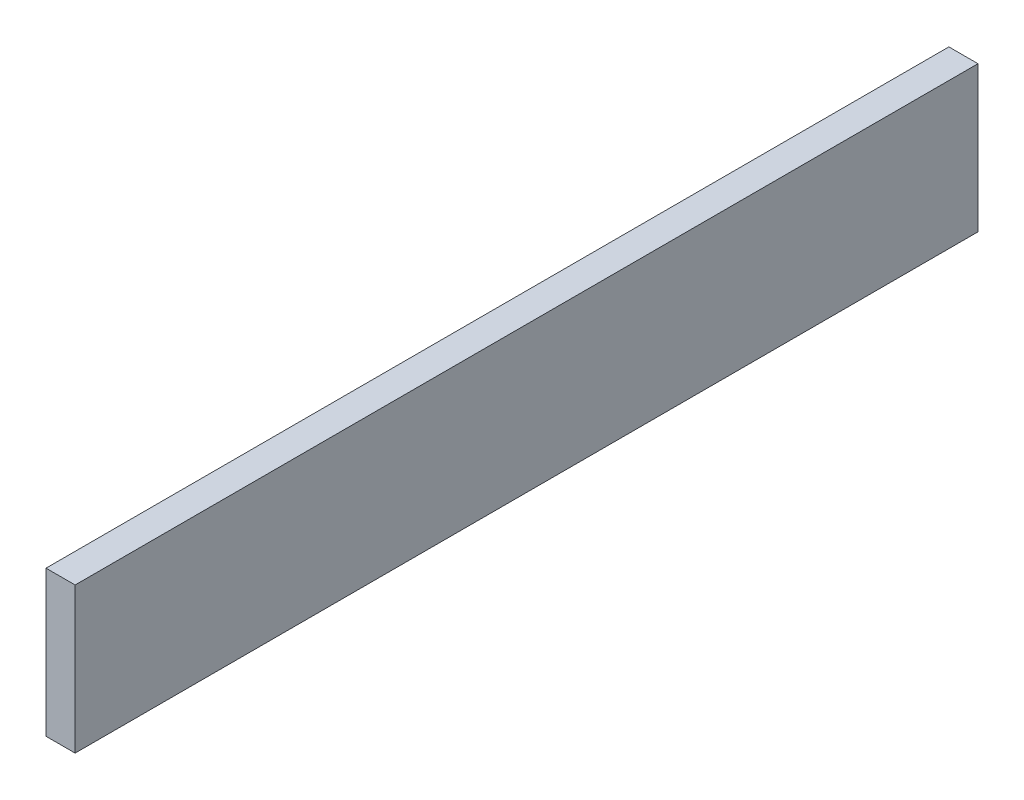
ISO-10303-21;
HEADER;
FILE_DESCRIPTION(('STEP AP214'),'2;1');
FILE_NAME('part.step','',(''),(''),'','','');
FILE_SCHEMA(('AUTOMOTIVE_DESIGN { 1 0 10303 214 1 1 1 1 }'));
ENDSEC;
DATA;
#1=APPLICATION_CONTEXT('core data for automotive mechanical design processes');
#2=APPLICATION_PROTOCOL_DEFINITION('international standard','automotive_design',2000,#1);
#3=PRODUCT_CONTEXT('',#1,'mechanical');
#4=PRODUCT('Part','Part','',(#3));
#5=PRODUCT_RELATED_PRODUCT_CATEGORY('part','',(#4));
#6=PRODUCT_DEFINITION_FORMATION('','',#4);
#7=PRODUCT_DEFINITION_CONTEXT('part definition',#1,'design');
#8=PRODUCT_DEFINITION('design','',#6,#7);
#9=PRODUCT_DEFINITION_SHAPE('','',#8);
#10=(LENGTH_UNIT() NAMED_UNIT(*) SI_UNIT(.MILLI.,.METRE.));
#11=(NAMED_UNIT(*) PLANE_ANGLE_UNIT() SI_UNIT($,.RADIAN.));
#12=(NAMED_UNIT(*) SI_UNIT($,.STERADIAN.) SOLID_ANGLE_UNIT());
#13=UNCERTAINTY_MEASURE_WITH_UNIT(LENGTH_MEASURE(1.E-05),#10,'distance_accuracy_value','');
#14=(GEOMETRIC_REPRESENTATION_CONTEXT(3) GLOBAL_UNCERTAINTY_ASSIGNED_CONTEXT((#13)) GLOBAL_UNIT_ASSIGNED_CONTEXT((#10,
#11,#12)) REPRESENTATION_CONTEXT('',''));
#15=CARTESIAN_POINT('',(0.,0.,0.));
#16=DIRECTION('',(0.,0.,1.));
#17=DIRECTION('',(1.,0.,0.));
#18=AXIS2_PLACEMENT_3D('',#15,#16,#17);
#19=CARTESIAN_POINT('',(12.7,0.,0.));
#20=DIRECTION('',(0.,0.,-1.));
#21=DIRECTION('',(-1.,0.,0.));
#22=AXIS2_PLACEMENT_3D('',#19,#20,#21);
#23=PLANE('',#22);
#24=DIRECTION('',(0.,-1.,0.));
#25=VECTOR('',#24,1.);
#26=CARTESIAN_POINT('',(0.,0.,0.));
#27=LINE('',#26,#25);
#28=CARTESIAN_POINT('',(0.,63.5,0.));
#29=VERTEX_POINT('',#28);
#30=CARTESIAN_POINT('',(0.,0.,0.));
#31=VERTEX_POINT('',#30);
#32=EDGE_CURVE('E107',#29,#31,#27,.T.);
#33=ORIENTED_EDGE('',*,*,#32,.T.);
#34=DIRECTION('',(-1.,0.,0.));
#35=VECTOR('',#34,1.);
#36=CARTESIAN_POINT('',(12.7,0.,0.));
#37=LINE('',#36,#35);
#38=CARTESIAN_POINT('',(12.7,0.,0.));
#39=VERTEX_POINT('',#38);
#40=EDGE_CURVE('E11',#39,#31,#37,.T.);
#41=ORIENTED_EDGE('',*,*,#40,.F.);
#42=DIRECTION('',(0.,-1.,0.));
#43=VECTOR('',#42,1.);
#44=CARTESIAN_POINT('',(12.7,0.,0.));
#45=LINE('',#44,#43);
#46=CARTESIAN_POINT('',(12.7,63.5,0.));
#47=VERTEX_POINT('',#46);
#48=EDGE_CURVE('E91',#47,#39,#45,.T.);
#49=ORIENTED_EDGE('',*,*,#48,.F.);
#50=DIRECTION('',(-1.,0.,0.));
#51=VECTOR('',#50,1.);
#52=CARTESIAN_POINT('',(12.7,63.5,0.));
#53=LINE('',#52,#51);
#54=EDGE_CURVE('E103',#47,#29,#53,.T.);
#55=ORIENTED_EDGE('',*,*,#54,.T.);
#56=EDGE_LOOP('',(#33,#41,#49,#55));
#57=FACE_BOUND('',#56,.T.);
#58=ADVANCED_FACE('F39',(#57),#23,.F.);
#59=CARTESIAN_POINT('',(12.7,0.,0.));
#60=DIRECTION('',(0.,1.,0.));
#61=DIRECTION('',(0.,0.,1.));
#62=AXIS2_PLACEMENT_3D('',#59,#60,#61);
#63=PLANE('',#62);
#64=DIRECTION('',(0.,0.,-1.));
#65=VECTOR('',#64,1.);
#66=CARTESIAN_POINT('',(0.,0.,0.));
#67=LINE('',#66,#65);
#68=CARTESIAN_POINT('',(0.,0.,-393.7));
#69=VERTEX_POINT('',#68);
#70=EDGE_CURVE('E96',#31,#69,#67,.T.);
#71=ORIENTED_EDGE('',*,*,#70,.T.);
#72=DIRECTION('',(-1.,0.,0.));
#73=VECTOR('',#72,1.);
#74=CARTESIAN_POINT('',(12.7,0.,-393.7));
#75=LINE('',#74,#73);
#76=CARTESIAN_POINT('',(12.7,0.,-393.7));
#77=VERTEX_POINT('',#76);
#78=EDGE_CURVE('E48',#77,#69,#75,.T.);
#79=ORIENTED_EDGE('',*,*,#78,.F.);
#80=DIRECTION('',(0.,0.,-1.));
#81=VECTOR('',#80,1.);
#82=CARTESIAN_POINT('',(12.7,0.,0.));
#83=LINE('',#82,#81);
#84=EDGE_CURVE('E86',#39,#77,#83,.T.);
#85=ORIENTED_EDGE('',*,*,#84,.F.);
#86=ORIENTED_EDGE('',*,*,#40,.T.);
#87=EDGE_LOOP('',(#71,#79,#85,#86));
#88=FACE_BOUND('',#87,.T.);
#89=ADVANCED_FACE('F95',(#88),#63,.F.);
#90=CARTESIAN_POINT('',(12.7,0.,-393.7));
#91=DIRECTION('',(0.,0.,1.));
#92=DIRECTION('',(1.,0.,0.));
#93=AXIS2_PLACEMENT_3D('',#90,#91,#92);
#94=PLANE('',#93);
#95=DIRECTION('',(0.,1.,0.));
#96=VECTOR('',#95,1.);
#97=CARTESIAN_POINT('',(0.,0.,-393.7));
#98=LINE('',#97,#96);
#99=CARTESIAN_POINT('',(0.,63.5,-393.7));
#100=VERTEX_POINT('',#99);
#101=EDGE_CURVE('E73',#69,#100,#98,.T.);
#102=ORIENTED_EDGE('',*,*,#101,.T.);
#103=DIRECTION('',(-1.,0.,0.));
#104=VECTOR('',#103,1.);
#105=CARTESIAN_POINT('',(12.7,63.5,-393.7));
#106=LINE('',#105,#104);
#107=CARTESIAN_POINT('',(12.7,63.5,-393.7));
#108=VERTEX_POINT('',#107);
#109=EDGE_CURVE('E98',#108,#100,#106,.T.);
#110=ORIENTED_EDGE('',*,*,#109,.F.);
#111=DIRECTION('',(0.,1.,0.));
#112=VECTOR('',#111,1.);
#113=CARTESIAN_POINT('',(12.7,0.,-393.7));
#114=LINE('',#113,#112);
#115=EDGE_CURVE('E89',#77,#108,#114,.T.);
#116=ORIENTED_EDGE('',*,*,#115,.F.);
#117=ORIENTED_EDGE('',*,*,#78,.T.);
#118=EDGE_LOOP('',(#102,#110,#116,#117));
#119=FACE_BOUND('',#118,.T.);
#120=ADVANCED_FACE('F99',(#119),#94,.F.);
#121=CARTESIAN_POINT('',(12.7,63.5,0.));
#122=DIRECTION('',(0.,-1.,0.));
#123=DIRECTION('',(0.,0.,-1.));
#124=AXIS2_PLACEMENT_3D('',#121,#122,#123);
#125=PLANE('',#124);
#126=DIRECTION('',(0.,0.,1.));
#127=VECTOR('',#126,1.);
#128=CARTESIAN_POINT('',(0.,63.5,0.));
#129=LINE('',#128,#127);
#130=EDGE_CURVE('E79',#100,#29,#129,.T.);
#131=ORIENTED_EDGE('',*,*,#130,.T.);
#132=ORIENTED_EDGE('',*,*,#54,.F.);
#133=DIRECTION('',(0.,0.,1.));
#134=VECTOR('',#133,1.);
#135=CARTESIAN_POINT('',(12.7,63.5,0.));
#136=LINE('',#135,#134);
#137=EDGE_CURVE('E56',#108,#47,#136,.T.);
#138=ORIENTED_EDGE('',*,*,#137,.F.);
#139=ORIENTED_EDGE('',*,*,#109,.T.);
#140=EDGE_LOOP('',(#131,#132,#138,#139));
#141=FACE_BOUND('',#140,.T.);
#142=ADVANCED_FACE('F120',(#141),#125,.F.);
#143=CARTESIAN_POINT('',(12.7,0.,0.));
#144=DIRECTION('',(-1.,0.,0.));
#145=DIRECTION('',(0.,0.,1.));
#146=AXIS2_PLACEMENT_3D('',#143,#144,#145);
#147=PLANE('',#146);
#148=ORIENTED_EDGE('',*,*,#48,.T.);
#149=ORIENTED_EDGE('',*,*,#84,.T.);
#150=ORIENTED_EDGE('',*,*,#115,.T.);
#151=ORIENTED_EDGE('',*,*,#137,.T.);
#152=EDGE_LOOP('',(#148,#149,#150,#151));
#153=FACE_BOUND('',#152,.T.);
#154=ADVANCED_FACE('F87',(#153),#147,.F.);
#155=CARTESIAN_POINT('',(0.,0.,0.));
#156=DIRECTION('',(-1.,0.,0.));
#157=DIRECTION('',(0.,0.,1.));
#158=AXIS2_PLACEMENT_3D('',#155,#156,#157);
#159=PLANE('',#158);
#160=ORIENTED_EDGE('',*,*,#32,.F.);
#161=ORIENTED_EDGE('',*,*,#130,.F.);
#162=ORIENTED_EDGE('',*,*,#101,.F.);
#163=ORIENTED_EDGE('',*,*,#70,.F.);
#164=EDGE_LOOP('',(#160,#161,#162,#163));
#165=FACE_BOUND('',#164,.T.);
#166=ADVANCED_FACE('F123',(#165),#159,.T.);
#167=CLOSED_SHELL('',(#58,#89,#120,#142,#154,#166));
#168=MANIFOLD_SOLID_BREP('B2',#167);
#169=ADVANCED_BREP_SHAPE_REPRESENTATION('',(#18,#168),#14);
#170=SHAPE_DEFINITION_REPRESENTATION(#9,#169);
ENDSEC;
END-ISO-10303-21;
